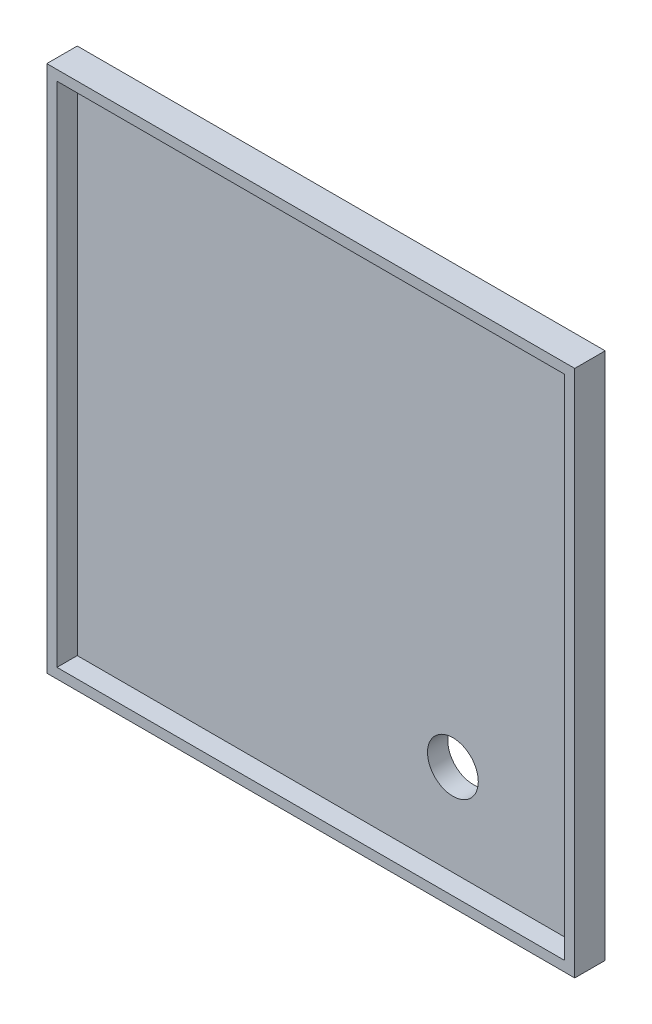
ISO-10303-21;
HEADER;
FILE_DESCRIPTION(('STEP AP214'),'2;1');
FILE_NAME('part.step','',(''),(''),'','','');
FILE_SCHEMA(('AUTOMOTIVE_DESIGN { 1 0 10303 214 1 1 1 1 }'));
ENDSEC;
DATA;
#1=APPLICATION_CONTEXT('core data for automotive mechanical design processes');
#2=APPLICATION_PROTOCOL_DEFINITION('international standard','automotive_design',2000,#1);
#3=PRODUCT_CONTEXT('',#1,'mechanical');
#4=PRODUCT('Part','Part','',(#3));
#5=PRODUCT_RELATED_PRODUCT_CATEGORY('part','',(#4));
#6=PRODUCT_DEFINITION_FORMATION('','',#4);
#7=PRODUCT_DEFINITION_CONTEXT('part definition',#1,'design');
#8=PRODUCT_DEFINITION('design','',#6,#7);
#9=PRODUCT_DEFINITION_SHAPE('','',#8);
#10=(LENGTH_UNIT() NAMED_UNIT(*) SI_UNIT(.MILLI.,.METRE.));
#11=(NAMED_UNIT(*) PLANE_ANGLE_UNIT() SI_UNIT($,.RADIAN.));
#12=(NAMED_UNIT(*) SI_UNIT($,.STERADIAN.) SOLID_ANGLE_UNIT());
#13=UNCERTAINTY_MEASURE_WITH_UNIT(LENGTH_MEASURE(1.E-05),#10,'distance_accuracy_value','');
#14=(GEOMETRIC_REPRESENTATION_CONTEXT(3) GLOBAL_UNCERTAINTY_ASSIGNED_CONTEXT((#13)) GLOBAL_UNIT_ASSIGNED_CONTEXT((#10,
#11,#12)) REPRESENTATION_CONTEXT('',''));
#15=CARTESIAN_POINT('',(0.,0.,0.));
#16=DIRECTION('',(0.,0.,1.));
#17=DIRECTION('',(1.,0.,0.));
#18=AXIS2_PLACEMENT_3D('',#15,#16,#17);
#19=CARTESIAN_POINT('',(0.,0.,10.));
#20=DIRECTION('',(0.,0.,-1.));
#21=DIRECTION('',(-1.,0.,0.));
#22=AXIS2_PLACEMENT_3D('',#19,#20,#21);
#23=PLANE('',#22);
#24=DIRECTION('',(-1.,0.,0.));
#25=VECTOR('',#24,1.);
#26=CARTESIAN_POINT('',(10.,510.,10.));
#27=LINE('',#26,#25);
#28=CARTESIAN_POINT('',(510.,510.,10.));
#29=VERTEX_POINT('',#28);
#30=CARTESIAN_POINT('',(10.,510.,10.));
#31=VERTEX_POINT('',#30);
#32=EDGE_CURVE('E132',#29,#31,#27,.T.);
#33=ORIENTED_EDGE('',*,*,#32,.T.);
#34=DIRECTION('',(0.,-1.,0.));
#35=VECTOR('',#34,1.);
#36=CARTESIAN_POINT('',(10.,10.,10.));
#37=LINE('',#36,#35);
#38=CARTESIAN_POINT('',(10.,10.,10.));
#39=VERTEX_POINT('',#38);
#40=EDGE_CURVE('E152',#31,#39,#37,.T.);
#41=ORIENTED_EDGE('',*,*,#40,.T.);
#42=DIRECTION('',(1.,0.,0.));
#43=VECTOR('',#42,1.);
#44=CARTESIAN_POINT('',(10.,10.,10.));
#45=LINE('',#44,#43);
#46=CARTESIAN_POINT('',(510.,10.,10.));
#47=VERTEX_POINT('',#46);
#48=EDGE_CURVE('E138',#39,#47,#45,.T.);
#49=ORIENTED_EDGE('',*,*,#48,.T.);
#50=DIRECTION('',(0.,1.,0.));
#51=VECTOR('',#50,1.);
#52=CARTESIAN_POINT('',(510.,10.,10.));
#53=LINE('',#52,#51);
#54=EDGE_CURVE('E156',#47,#29,#53,.T.);
#55=ORIENTED_EDGE('',*,*,#54,.T.);
#56=EDGE_LOOP('',(#33,#41,#49,#55));
#57=FACE_BOUND('',#56,.T.);
#58=DIRECTION('',(0.,-1.,0.));
#59=VECTOR('',#58,1.);
#60=CARTESIAN_POINT('',(20.,500.,10.));
#61=LINE('',#60,#59);
#62=CARTESIAN_POINT('',(20.,500.,10.));
#63=VERTEX_POINT('',#62);
#64=CARTESIAN_POINT('',(20.0000000000001,20.,10.));
#65=VERTEX_POINT('',#64);
#66=EDGE_CURVE('E176',#63,#65,#61,.T.);
#67=ORIENTED_EDGE('',*,*,#66,.F.);
#68=DIRECTION('',(-1.,0.,0.));
#69=VECTOR('',#68,1.);
#70=CARTESIAN_POINT('',(20.,500.,10.));
#71=LINE('',#70,#69);
#72=CARTESIAN_POINT('',(500.,500.,10.));
#73=VERTEX_POINT('',#72);
#74=EDGE_CURVE('E181',#73,#63,#71,.T.);
#75=ORIENTED_EDGE('',*,*,#74,.F.);
#76=DIRECTION('',(0.,1.,0.));
#77=VECTOR('',#76,1.);
#78=CARTESIAN_POINT('',(500.,500.,10.));
#79=LINE('',#78,#77);
#80=CARTESIAN_POINT('',(500.,20.,10.));
#81=VERTEX_POINT('',#80);
#82=EDGE_CURVE('E191',#81,#73,#79,.T.);
#83=ORIENTED_EDGE('',*,*,#82,.F.);
#84=DIRECTION('',(1.,0.,0.));
#85=VECTOR('',#84,1.);
#86=CARTESIAN_POINT('',(20.0000000000001,20.,10.));
#87=LINE('',#86,#85);
#88=EDGE_CURVE('E56',#65,#81,#87,.T.);
#89=ORIENTED_EDGE('',*,*,#88,.F.);
#90=EDGE_LOOP('',(#67,#75,#83,#89));
#91=FACE_BOUND('',#90,.T.);
#92=ADVANCED_FACE('F33',(#57,#91),#23,.F.);
#93=CARTESIAN_POINT('',(20.,500.,20.));
#94=DIRECTION('',(1.,0.,0.));
#95=DIRECTION('',(0.,1.,0.));
#96=AXIS2_PLACEMENT_3D('',#93,#94,#95);
#97=PLANE('',#96);
#98=ORIENTED_EDGE('',*,*,#66,.T.);
#99=DIRECTION('',(0.,0.,-1.));
#100=VECTOR('',#99,1.);
#101=CARTESIAN_POINT('',(20.0000000000001,20.,20.));
#102=LINE('',#101,#100);
#103=CARTESIAN_POINT('',(20.0000000000001,20.,20.));
#104=VERTEX_POINT('',#103);
#105=EDGE_CURVE('E204',#104,#65,#102,.T.);
#106=ORIENTED_EDGE('',*,*,#105,.F.);
#107=DIRECTION('',(0.,-1.,0.));
#108=VECTOR('',#107,1.);
#109=CARTESIAN_POINT('',(20.,500.,20.));
#110=LINE('',#109,#108);
#111=CARTESIAN_POINT('',(20.,500.,20.));
#112=VERTEX_POINT('',#111);
#113=EDGE_CURVE('E177',#112,#104,#110,.T.);
#114=ORIENTED_EDGE('',*,*,#113,.F.);
#115=DIRECTION('',(0.,0.,-1.));
#116=VECTOR('',#115,1.);
#117=CARTESIAN_POINT('',(20.,500.,20.));
#118=LINE('',#117,#116);
#119=EDGE_CURVE('E187',#112,#63,#118,.T.);
#120=ORIENTED_EDGE('',*,*,#119,.T.);
#121=EDGE_LOOP('',(#98,#106,#114,#120));
#122=FACE_BOUND('',#121,.T.);
#123=ADVANCED_FACE('F246',(#122),#97,.F.);
#124=CARTESIAN_POINT('',(20.0000000000001,20.,20.));
#125=DIRECTION('',(0.,1.,0.));
#126=DIRECTION('',(-1.,0.,0.));
#127=AXIS2_PLACEMENT_3D('',#124,#125,#126);
#128=PLANE('',#127);
#129=ORIENTED_EDGE('',*,*,#88,.T.);
#130=DIRECTION('',(0.,0.,-1.));
#131=VECTOR('',#130,1.);
#132=CARTESIAN_POINT('',(500.,20.,20.));
#133=LINE('',#132,#131);
#134=CARTESIAN_POINT('',(500.,20.,20.));
#135=VERTEX_POINT('',#134);
#136=EDGE_CURVE('E201',#135,#81,#133,.T.);
#137=ORIENTED_EDGE('',*,*,#136,.F.);
#138=DIRECTION('',(1.,0.,0.));
#139=VECTOR('',#138,1.);
#140=CARTESIAN_POINT('',(20.0000000000001,20.,20.));
#141=LINE('',#140,#139);
#142=EDGE_CURVE('E180',#104,#135,#141,.T.);
#143=ORIENTED_EDGE('',*,*,#142,.F.);
#144=ORIENTED_EDGE('',*,*,#105,.T.);
#145=EDGE_LOOP('',(#129,#137,#143,#144));
#146=FACE_BOUND('',#145,.T.);
#147=ADVANCED_FACE('F252',(#146),#128,.F.);
#148=CARTESIAN_POINT('',(500.,500.,20.));
#149=DIRECTION('',(-1.,0.,0.));
#150=DIRECTION('',(0.,-1.,0.));
#151=AXIS2_PLACEMENT_3D('',#148,#149,#150);
#152=PLANE('',#151);
#153=ORIENTED_EDGE('',*,*,#82,.T.);
#154=DIRECTION('',(0.,0.,-1.));
#155=VECTOR('',#154,1.);
#156=CARTESIAN_POINT('',(500.,500.,20.));
#157=LINE('',#156,#155);
#158=CARTESIAN_POINT('',(500.,500.,20.));
#159=VERTEX_POINT('',#158);
#160=EDGE_CURVE('E198',#159,#73,#157,.T.);
#161=ORIENTED_EDGE('',*,*,#160,.F.);
#162=DIRECTION('',(0.,1.,0.));
#163=VECTOR('',#162,1.);
#164=CARTESIAN_POINT('',(500.,500.,20.));
#165=LINE('',#164,#163);
#166=EDGE_CURVE('E183',#135,#159,#165,.T.);
#167=ORIENTED_EDGE('',*,*,#166,.F.);
#168=ORIENTED_EDGE('',*,*,#136,.T.);
#169=EDGE_LOOP('',(#153,#161,#167,#168));
#170=FACE_BOUND('',#169,.T.);
#171=ADVANCED_FACE('F325',(#170),#152,.F.);
#172=CARTESIAN_POINT('',(20.,500.,20.));
#173=DIRECTION('',(0.,-1.,0.));
#174=DIRECTION('',(0.,0.,-1.));
#175=AXIS2_PLACEMENT_3D('',#172,#173,#174);
#176=PLANE('',#175);
#177=ORIENTED_EDGE('',*,*,#74,.T.);
#178=ORIENTED_EDGE('',*,*,#119,.F.);
#179=DIRECTION('',(-1.,0.,0.));
#180=VECTOR('',#179,1.);
#181=CARTESIAN_POINT('',(20.,500.,20.));
#182=LINE('',#181,#180);
#183=EDGE_CURVE('E185',#159,#112,#182,.T.);
#184=ORIENTED_EDGE('',*,*,#183,.F.);
#185=ORIENTED_EDGE('',*,*,#160,.T.);
#186=EDGE_LOOP('',(#177,#178,#184,#185));
#187=FACE_BOUND('',#186,.T.);
#188=ADVANCED_FACE('F296',(#187),#176,.F.);
#189=CARTESIAN_POINT('',(0.,0.,20.));
#190=DIRECTION('',(0.,0.,1.));
#191=DIRECTION('',(1.,0.,0.));
#192=AXIS2_PLACEMENT_3D('',#189,#190,#191);
#193=PLANE('',#192);
#194=CARTESIAN_POINT('',(390.,110.,20.));
#195=DIRECTION('',(0.,0.,1.));
#196=DIRECTION('',(1.,0.,0.));
#197=AXIS2_PLACEMENT_3D('',#194,#195,#196);
#198=CIRCLE('',#197,25.);
#199=CARTESIAN_POINT('',(415.,110.,20.));
#200=VERTEX_POINT('',#199);
#201=EDGE_CURVE('E154',#200,#200,#198,.T.);
#202=ORIENTED_EDGE('',*,*,#201,.F.);
#203=EDGE_LOOP('',(#202));
#204=FACE_BOUND('',#203,.T.);
#205=ORIENTED_EDGE('',*,*,#113,.T.);
#206=ORIENTED_EDGE('',*,*,#142,.T.);
#207=ORIENTED_EDGE('',*,*,#166,.T.);
#208=ORIENTED_EDGE('',*,*,#183,.T.);
#209=EDGE_LOOP('',(#205,#206,#207,#208));
#210=FACE_BOUND('',#209,.T.);
#211=ADVANCED_FACE('F293',(#204,#210),#193,.T.);
#212=CARTESIAN_POINT('',(0.,0.,30.));
#213=DIRECTION('',(0.,0.,-1.));
#214=DIRECTION('',(-1.,0.,0.));
#215=AXIS2_PLACEMENT_3D('',#212,#213,#214);
#216=PLANE('',#215);
#217=DIRECTION('',(0.,-1.,0.));
#218=VECTOR('',#217,1.);
#219=CARTESIAN_POINT('',(0.,0.,30.));
#220=LINE('',#219,#218);
#221=CARTESIAN_POINT('',(0.,520.,30.));
#222=VERTEX_POINT('',#221);
#223=CARTESIAN_POINT('',(0.,0.,30.));
#224=VERTEX_POINT('',#223);
#225=EDGE_CURVE('E139',#222,#224,#220,.T.);
#226=ORIENTED_EDGE('',*,*,#225,.T.);
#227=DIRECTION('',(1.,0.,0.));
#228=VECTOR('',#227,1.);
#229=CARTESIAN_POINT('',(0.,0.,30.));
#230=LINE('',#229,#228);
#231=CARTESIAN_POINT('',(520.,0.,30.));
#232=VERTEX_POINT('',#231);
#233=EDGE_CURVE('E167',#224,#232,#230,.T.);
#234=ORIENTED_EDGE('',*,*,#233,.T.);
#235=DIRECTION('',(0.,1.,0.));
#236=VECTOR('',#235,1.);
#237=CARTESIAN_POINT('',(520.,0.,30.));
#238=LINE('',#237,#236);
#239=CARTESIAN_POINT('',(520.,520.,30.));
#240=VERTEX_POINT('',#239);
#241=EDGE_CURVE('E170',#232,#240,#238,.T.);
#242=ORIENTED_EDGE('',*,*,#241,.T.);
#243=DIRECTION('',(-1.,0.,0.));
#244=VECTOR('',#243,1.);
#245=CARTESIAN_POINT('',(0.,520.,30.));
#246=LINE('',#245,#244);
#247=EDGE_CURVE('E173',#240,#222,#246,.T.);
#248=ORIENTED_EDGE('',*,*,#247,.T.);
#249=EDGE_LOOP('',(#226,#234,#242,#248));
#250=FACE_BOUND('',#249,.T.);
#251=DIRECTION('',(0.,-1.,0.));
#252=VECTOR('',#251,1.);
#253=CARTESIAN_POINT('',(10.,10.,30.));
#254=LINE('',#253,#252);
#255=CARTESIAN_POINT('',(10.,510.,30.));
#256=VERTEX_POINT('',#255);
#257=CARTESIAN_POINT('',(10.,10.,30.));
#258=VERTEX_POINT('',#257);
#259=EDGE_CURVE('E123',#256,#258,#254,.T.);
#260=ORIENTED_EDGE('',*,*,#259,.F.);
#261=DIRECTION('',(-1.,0.,0.));
#262=VECTOR('',#261,1.);
#263=CARTESIAN_POINT('',(10.,510.,30.));
#264=LINE('',#263,#262);
#265=CARTESIAN_POINT('',(510.,510.,30.));
#266=VERTEX_POINT('',#265);
#267=EDGE_CURVE('E147',#266,#256,#264,.T.);
#268=ORIENTED_EDGE('',*,*,#267,.F.);
#269=DIRECTION('',(0.,1.,0.));
#270=VECTOR('',#269,1.);
#271=CARTESIAN_POINT('',(510.,10.,30.));
#272=LINE('',#271,#270);
#273=CARTESIAN_POINT('',(510.,10.,30.));
#274=VERTEX_POINT('',#273);
#275=EDGE_CURVE('E145',#274,#266,#272,.T.);
#276=ORIENTED_EDGE('',*,*,#275,.F.);
#277=DIRECTION('',(1.,0.,0.));
#278=VECTOR('',#277,1.);
#279=CARTESIAN_POINT('',(10.,10.,30.));
#280=LINE('',#279,#278);
#281=EDGE_CURVE('E131',#258,#274,#280,.T.);
#282=ORIENTED_EDGE('',*,*,#281,.F.);
#283=EDGE_LOOP('',(#260,#268,#276,#282));
#284=FACE_BOUND('',#283,.T.);
#285=ADVANCED_FACE('F143',(#250,#284),#216,.F.);
#286=CARTESIAN_POINT('',(10.,10.,30.));
#287=DIRECTION('',(1.,0.,0.));
#288=DIRECTION('',(0.,0.,-1.));
#289=AXIS2_PLACEMENT_3D('',#286,#287,#288);
#290=PLANE('',#289);
#291=ORIENTED_EDGE('',*,*,#40,.F.);
#292=DIRECTION('',(0.,0.,-1.));
#293=VECTOR('',#292,1.);
#294=CARTESIAN_POINT('',(10.,510.,30.));
#295=LINE('',#294,#293);
#296=EDGE_CURVE('E48',#256,#31,#295,.T.);
#297=ORIENTED_EDGE('',*,*,#296,.F.);
#298=ORIENTED_EDGE('',*,*,#259,.T.);
#299=DIRECTION('',(0.,0.,-1.));
#300=VECTOR('',#299,1.);
#301=CARTESIAN_POINT('',(10.,10.,30.));
#302=LINE('',#301,#300);
#303=EDGE_CURVE('E126',#258,#39,#302,.T.);
#304=ORIENTED_EDGE('',*,*,#303,.T.);
#305=EDGE_LOOP('',(#291,#297,#298,#304));
#306=FACE_BOUND('',#305,.T.);
#307=ADVANCED_FACE('F125',(#306),#290,.T.);
#308=CARTESIAN_POINT('',(10.,10.,30.));
#309=DIRECTION('',(0.,1.,0.));
#310=DIRECTION('',(0.,0.,1.));
#311=AXIS2_PLACEMENT_3D('',#308,#309,#310);
#312=PLANE('',#311);
#313=ORIENTED_EDGE('',*,*,#48,.F.);
#314=ORIENTED_EDGE('',*,*,#303,.F.);
#315=ORIENTED_EDGE('',*,*,#281,.T.);
#316=DIRECTION('',(0.,0.,-1.));
#317=VECTOR('',#316,1.);
#318=CARTESIAN_POINT('',(510.,10.,30.));
#319=LINE('',#318,#317);
#320=EDGE_CURVE('E140',#274,#47,#319,.T.);
#321=ORIENTED_EDGE('',*,*,#320,.T.);
#322=EDGE_LOOP('',(#313,#314,#315,#321));
#323=FACE_BOUND('',#322,.T.);
#324=ADVANCED_FACE('F135',(#323),#312,.T.);
#325=CARTESIAN_POINT('',(510.,10.,30.));
#326=DIRECTION('',(-1.,0.,0.));
#327=DIRECTION('',(0.,0.,1.));
#328=AXIS2_PLACEMENT_3D('',#325,#326,#327);
#329=PLANE('',#328);
#330=ORIENTED_EDGE('',*,*,#54,.F.);
#331=ORIENTED_EDGE('',*,*,#320,.F.);
#332=ORIENTED_EDGE('',*,*,#275,.T.);
#333=DIRECTION('',(0.,0.,-1.));
#334=VECTOR('',#333,1.);
#335=CARTESIAN_POINT('',(510.,510.,30.));
#336=LINE('',#335,#334);
#337=EDGE_CURVE('E162',#266,#29,#336,.T.);
#338=ORIENTED_EDGE('',*,*,#337,.T.);
#339=EDGE_LOOP('',(#330,#331,#332,#338));
#340=FACE_BOUND('',#339,.T.);
#341=ADVANCED_FACE('F315',(#340),#329,.T.);
#342=CARTESIAN_POINT('',(10.,510.,30.));
#343=DIRECTION('',(0.,-1.,0.));
#344=DIRECTION('',(0.,0.,-1.));
#345=AXIS2_PLACEMENT_3D('',#342,#343,#344);
#346=PLANE('',#345);
#347=ORIENTED_EDGE('',*,*,#32,.F.);
#348=ORIENTED_EDGE('',*,*,#337,.F.);
#349=ORIENTED_EDGE('',*,*,#267,.T.);
#350=ORIENTED_EDGE('',*,*,#296,.T.);
#351=EDGE_LOOP('',(#347,#348,#349,#350));
#352=FACE_BOUND('',#351,.T.);
#353=ADVANCED_FACE('F259',(#352),#346,.T.);
#354=CARTESIAN_POINT('',(0.,0.,0.));
#355=DIRECTION('',(0.,0.,-1.));
#356=DIRECTION('',(-1.,0.,0.));
#357=AXIS2_PLACEMENT_3D('',#354,#355,#356);
#358=PLANE('',#357);
#359=CARTESIAN_POINT('',(390.,110.,0.));
#360=DIRECTION('',(0.,0.,-1.));
#361=DIRECTION('',(-1.,0.,0.));
#362=AXIS2_PLACEMENT_3D('',#359,#360,#361);
#363=CIRCLE('',#362,25.);
#364=CARTESIAN_POINT('',(365.,110.,0.));
#365=VERTEX_POINT('',#364);
#366=EDGE_CURVE('E415',#365,#365,#363,.T.);
#367=ORIENTED_EDGE('',*,*,#366,.F.);
#368=EDGE_LOOP('',(#367));
#369=FACE_BOUND('',#368,.T.);
#370=DIRECTION('',(0.,-1.,0.));
#371=VECTOR('',#370,1.);
#372=CARTESIAN_POINT('',(0.,0.,0.));
#373=LINE('',#372,#371);
#374=CARTESIAN_POINT('',(0.,520.,0.));
#375=VERTEX_POINT('',#374);
#376=CARTESIAN_POINT('',(0.,0.,0.));
#377=VERTEX_POINT('',#376);
#378=EDGE_CURVE('E206',#375,#377,#373,.T.);
#379=ORIENTED_EDGE('',*,*,#378,.F.);
#380=DIRECTION('',(-1.,0.,0.));
#381=VECTOR('',#380,1.);
#382=CARTESIAN_POINT('',(0.,520.,0.));
#383=LINE('',#382,#381);
#384=CARTESIAN_POINT('',(520.,520.,0.));
#385=VERTEX_POINT('',#384);
#386=EDGE_CURVE('E213',#385,#375,#383,.T.);
#387=ORIENTED_EDGE('',*,*,#386,.F.);
#388=DIRECTION('',(0.,1.,0.));
#389=VECTOR('',#388,1.);
#390=CARTESIAN_POINT('',(520.,0.,0.));
#391=LINE('',#390,#389);
#392=CARTESIAN_POINT('',(520.,0.,0.));
#393=VERTEX_POINT('',#392);
#394=EDGE_CURVE('E211',#393,#385,#391,.T.);
#395=ORIENTED_EDGE('',*,*,#394,.F.);
#396=DIRECTION('',(1.,0.,0.));
#397=VECTOR('',#396,1.);
#398=CARTESIAN_POINT('',(0.,0.,0.));
#399=LINE('',#398,#397);
#400=EDGE_CURVE('E209',#377,#393,#399,.T.);
#401=ORIENTED_EDGE('',*,*,#400,.F.);
#402=EDGE_LOOP('',(#379,#387,#395,#401));
#403=FACE_BOUND('',#402,.T.);
#404=ADVANCED_FACE('F230',(#369,#403),#358,.T.);
#405=CARTESIAN_POINT('',(0.,520.,10.));
#406=DIRECTION('',(0.,-1.,0.));
#407=DIRECTION('',(0.,0.,-1.));
#408=AXIS2_PLACEMENT_3D('',#405,#406,#407);
#409=PLANE('',#408);
#410=ORIENTED_EDGE('',*,*,#386,.T.);
#411=DIRECTION('',(0.,0.,-1.));
#412=VECTOR('',#411,1.);
#413=CARTESIAN_POINT('',(0.,520.,10.));
#414=LINE('',#413,#412);
#415=EDGE_CURVE('E215',#222,#375,#414,.T.);
#416=ORIENTED_EDGE('',*,*,#415,.F.);
#417=ORIENTED_EDGE('',*,*,#247,.F.);
#418=DIRECTION('',(0.,0.,-1.));
#419=VECTOR('',#418,1.);
#420=CARTESIAN_POINT('',(520.,520.,10.));
#421=LINE('',#420,#419);
#422=EDGE_CURVE('E218',#240,#385,#421,.T.);
#423=ORIENTED_EDGE('',*,*,#422,.T.);
#424=EDGE_LOOP('',(#410,#416,#417,#423));
#425=FACE_BOUND('',#424,.T.);
#426=ADVANCED_FACE('F232',(#425),#409,.F.);
#427=CARTESIAN_POINT('',(520.,0.,10.));
#428=DIRECTION('',(-1.,0.,0.));
#429=DIRECTION('',(0.,0.,1.));
#430=AXIS2_PLACEMENT_3D('',#427,#428,#429);
#431=PLANE('',#430);
#432=ORIENTED_EDGE('',*,*,#394,.T.);
#433=ORIENTED_EDGE('',*,*,#422,.F.);
#434=ORIENTED_EDGE('',*,*,#241,.F.);
#435=DIRECTION('',(0.,0.,-1.));
#436=VECTOR('',#435,1.);
#437=CARTESIAN_POINT('',(520.,0.,10.));
#438=LINE('',#437,#436);
#439=EDGE_CURVE('E41',#232,#393,#438,.T.);
#440=ORIENTED_EDGE('',*,*,#439,.T.);
#441=EDGE_LOOP('',(#432,#433,#434,#440));
#442=FACE_BOUND('',#441,.T.);
#443=ADVANCED_FACE('F224',(#442),#431,.F.);
#444=CARTESIAN_POINT('',(0.,0.,10.));
#445=DIRECTION('',(0.,1.,0.));
#446=DIRECTION('',(0.,0.,1.));
#447=AXIS2_PLACEMENT_3D('',#444,#445,#446);
#448=PLANE('',#447);
#449=ORIENTED_EDGE('',*,*,#400,.T.);
#450=ORIENTED_EDGE('',*,*,#439,.F.);
#451=ORIENTED_EDGE('',*,*,#233,.F.);
#452=DIRECTION('',(0.,0.,-1.));
#453=VECTOR('',#452,1.);
#454=CARTESIAN_POINT('',(0.,0.,10.));
#455=LINE('',#454,#453);
#456=EDGE_CURVE('E11',#224,#377,#455,.T.);
#457=ORIENTED_EDGE('',*,*,#456,.T.);
#458=EDGE_LOOP('',(#449,#450,#451,#457));
#459=FACE_BOUND('',#458,.T.);
#460=ADVANCED_FACE('F237',(#459),#448,.F.);
#461=CARTESIAN_POINT('',(0.,0.,10.));
#462=DIRECTION('',(1.,0.,0.));
#463=DIRECTION('',(0.,0.,-1.));
#464=AXIS2_PLACEMENT_3D('',#461,#462,#463);
#465=PLANE('',#464);
#466=ORIENTED_EDGE('',*,*,#378,.T.);
#467=ORIENTED_EDGE('',*,*,#456,.F.);
#468=ORIENTED_EDGE('',*,*,#225,.F.);
#469=ORIENTED_EDGE('',*,*,#415,.T.);
#470=EDGE_LOOP('',(#466,#467,#468,#469));
#471=FACE_BOUND('',#470,.T.);
#472=ADVANCED_FACE('F35',(#471),#465,.F.);
#473=CARTESIAN_POINT('',(390.,110.,30.));
#474=DIRECTION('',(0.,0.,-1.));
#475=DIRECTION('',(-1.,0.,0.));
#476=AXIS2_PLACEMENT_3D('',#473,#474,#475);
#477=CYLINDRICAL_SURFACE('',#476,25.);
#478=ORIENTED_EDGE('',*,*,#201,.T.);
#479=EDGE_LOOP('',(#478));
#480=FACE_BOUND('',#479,.T.);
#481=ORIENTED_EDGE('',*,*,#366,.T.);
#482=EDGE_LOOP('',(#481));
#483=FACE_BOUND('',#482,.T.);
#484=ADVANCED_FACE('F243',(#480,#483),#477,.F.);
#485=CLOSED_SHELL('',(#92,#123,#147,#171,#188,#211,#285,#307,#324,#341,#353,#404,#426,#443,#460,
#472,#484));
#486=MANIFOLD_SOLID_BREP('B2',#485);
#487=ADVANCED_BREP_SHAPE_REPRESENTATION('',(#18,#486),#14);
#488=SHAPE_DEFINITION_REPRESENTATION(#9,#487);
ENDSEC;
END-ISO-10303-21;
